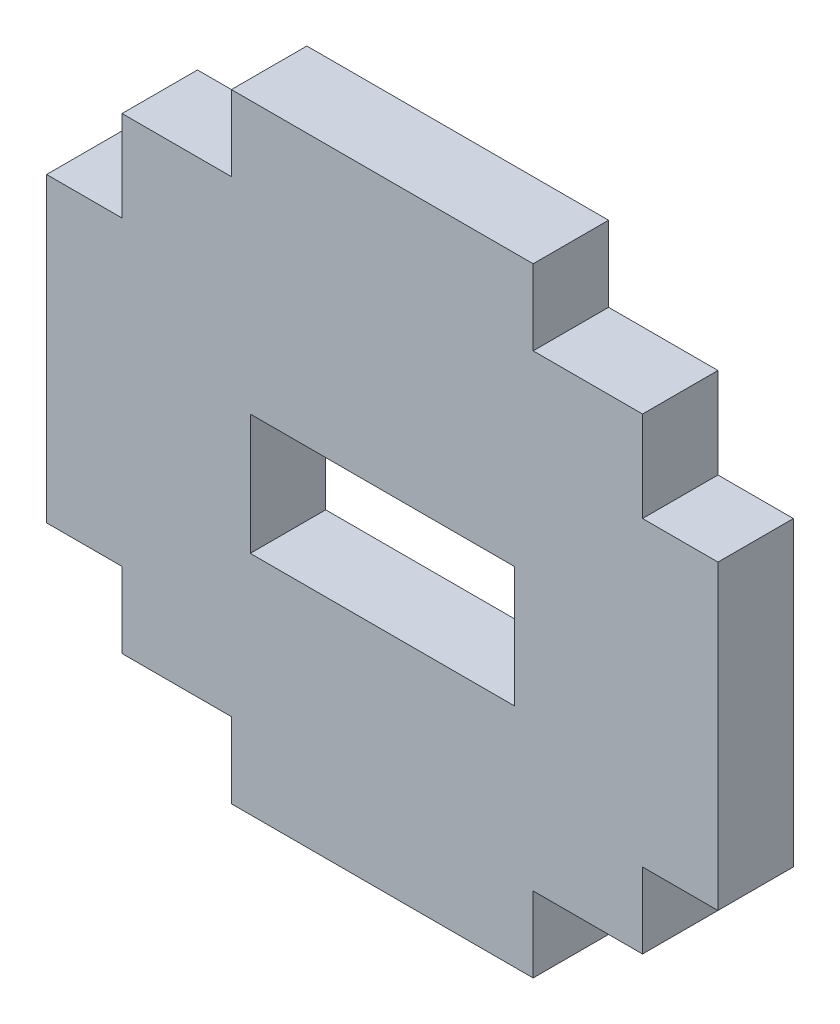
ISO-10303-21;
HEADER;
FILE_DESCRIPTION(('STEP AP214'),'2;1');
FILE_NAME('part.step','',(''),(''),'','','');
FILE_SCHEMA(('AUTOMOTIVE_DESIGN { 1 0 10303 214 1 1 1 1 }'));
ENDSEC;
DATA;
#1=APPLICATION_CONTEXT('core data for automotive mechanical design processes');
#2=APPLICATION_PROTOCOL_DEFINITION('international standard','automotive_design',2000,#1);
#3=PRODUCT_CONTEXT('',#1,'mechanical');
#4=PRODUCT('Part','Part','',(#3));
#5=PRODUCT_RELATED_PRODUCT_CATEGORY('part','',(#4));
#6=PRODUCT_DEFINITION_FORMATION('','',#4);
#7=PRODUCT_DEFINITION_CONTEXT('part definition',#1,'design');
#8=PRODUCT_DEFINITION('design','',#6,#7);
#9=PRODUCT_DEFINITION_SHAPE('','',#8);
#10=(LENGTH_UNIT() NAMED_UNIT(*) SI_UNIT(.MILLI.,.METRE.));
#11=(NAMED_UNIT(*) PLANE_ANGLE_UNIT() SI_UNIT($,.RADIAN.));
#12=(NAMED_UNIT(*) SI_UNIT($,.STERADIAN.) SOLID_ANGLE_UNIT());
#13=UNCERTAINTY_MEASURE_WITH_UNIT(LENGTH_MEASURE(1.E-05),#10,'distance_accuracy_value','');
#14=(GEOMETRIC_REPRESENTATION_CONTEXT(3) GLOBAL_UNCERTAINTY_ASSIGNED_CONTEXT((#13)) GLOBAL_UNIT_ASSIGNED_CONTEXT((#10,
#11,#12)) REPRESENTATION_CONTEXT('',''));
#15=CARTESIAN_POINT('',(0.,0.,0.));
#16=DIRECTION('',(0.,0.,1.));
#17=DIRECTION('',(1.,0.,0.));
#18=AXIS2_PLACEMENT_3D('',#15,#16,#17);
#19=CARTESIAN_POINT('',(0.,18.,5.));
#20=DIRECTION('',(0.,1.,0.));
#21=DIRECTION('',(0.,0.,1.));
#22=AXIS2_PLACEMENT_3D('',#19,#20,#21);
#23=PLANE('',#22);
#24=DIRECTION('',(1.,0.,0.));
#25=VECTOR('',#24,1.);
#26=CARTESIAN_POINT('',(0.,18.,0.));
#27=LINE('',#26,#25);
#28=CARTESIAN_POINT('',(8.5,18.,0.));
#29=VERTEX_POINT('',#28);
#30=CARTESIAN_POINT('',(26.,18.,0.));
#31=VERTEX_POINT('',#30);
#32=EDGE_CURVE('E274',#29,#31,#27,.T.);
#33=ORIENTED_EDGE('',*,*,#32,.T.);
#34=DIRECTION('',(0.,0.,-1.));
#35=VECTOR('',#34,1.);
#36=CARTESIAN_POINT('',(26.,18.,5.));
#37=LINE('',#36,#35);
#38=CARTESIAN_POINT('',(26.,18.,5.));
#39=VERTEX_POINT('',#38);
#40=EDGE_CURVE('E11',#39,#31,#37,.T.);
#41=ORIENTED_EDGE('',*,*,#40,.F.);
#42=DIRECTION('',(1.,0.,0.));
#43=VECTOR('',#42,1.);
#44=CARTESIAN_POINT('',(0.,18.,5.));
#45=LINE('',#44,#43);
#46=CARTESIAN_POINT('',(8.5,18.,5.));
#47=VERTEX_POINT('',#46);
#48=EDGE_CURVE('E209',#47,#39,#45,.T.);
#49=ORIENTED_EDGE('',*,*,#48,.F.);
#50=DIRECTION('',(0.,0.,-1.));
#51=VECTOR('',#50,1.);
#52=CARTESIAN_POINT('',(8.5,18.,5.));
#53=LINE('',#52,#51);
#54=EDGE_CURVE('E53',#47,#29,#53,.T.);
#55=ORIENTED_EDGE('',*,*,#54,.T.);
#56=EDGE_LOOP('',(#33,#41,#49,#55));
#57=FACE_BOUND('',#56,.T.);
#58=ADVANCED_FACE('F34',(#57),#23,.F.);
#59=CARTESIAN_POINT('',(26.,0.,5.));
#60=DIRECTION('',(1.,0.,0.));
#61=DIRECTION('',(0.,0.,-1.));
#62=AXIS2_PLACEMENT_3D('',#59,#60,#61);
#63=PLANE('',#62);
#64=DIRECTION('',(0.,-1.,0.));
#65=VECTOR('',#64,1.);
#66=CARTESIAN_POINT('',(26.,0.,0.));
#67=LINE('',#66,#65);
#68=CARTESIAN_POINT('',(26.,10.,0.));
#69=VERTEX_POINT('',#68);
#70=EDGE_CURVE('E215',#31,#69,#67,.T.);
#71=ORIENTED_EDGE('',*,*,#70,.T.);
#72=DIRECTION('',(0.,0.,-1.));
#73=VECTOR('',#72,1.);
#74=CARTESIAN_POINT('',(26.,10.,5.));
#75=LINE('',#74,#73);
#76=CARTESIAN_POINT('',(26.,10.,5.));
#77=VERTEX_POINT('',#76);
#78=EDGE_CURVE('E44',#77,#69,#75,.T.);
#79=ORIENTED_EDGE('',*,*,#78,.F.);
#80=DIRECTION('',(0.,-1.,0.));
#81=VECTOR('',#80,1.);
#82=CARTESIAN_POINT('',(26.,0.,5.));
#83=LINE('',#82,#81);
#84=EDGE_CURVE('E203',#39,#77,#83,.T.);
#85=ORIENTED_EDGE('',*,*,#84,.F.);
#86=ORIENTED_EDGE('',*,*,#40,.T.);
#87=EDGE_LOOP('',(#71,#79,#85,#86));
#88=FACE_BOUND('',#87,.T.);
#89=ADVANCED_FACE('F214',(#88),#63,.F.);
#90=CARTESIAN_POINT('',(0.,10.,5.));
#91=DIRECTION('',(0.,1.,0.));
#92=DIRECTION('',(0.,0.,1.));
#93=AXIS2_PLACEMENT_3D('',#90,#91,#92);
#94=PLANE('',#93);
#95=DIRECTION('',(1.,0.,0.));
#96=VECTOR('',#95,1.);
#97=CARTESIAN_POINT('',(0.,10.,0.));
#98=LINE('',#97,#96);
#99=CARTESIAN_POINT('',(8.5,10.,0.));
#100=VERTEX_POINT('',#99);
#101=EDGE_CURVE('E277',#100,#69,#98,.T.);
#102=ORIENTED_EDGE('',*,*,#101,.F.);
#103=DIRECTION('',(0.,0.,-1.));
#104=VECTOR('',#103,1.);
#105=CARTESIAN_POINT('',(8.5,10.,5.));
#106=LINE('',#105,#104);
#107=CARTESIAN_POINT('',(8.5,10.,5.));
#108=VERTEX_POINT('',#107);
#109=EDGE_CURVE('E127',#108,#100,#106,.T.);
#110=ORIENTED_EDGE('',*,*,#109,.F.);
#111=DIRECTION('',(1.,0.,0.));
#112=VECTOR('',#111,1.);
#113=CARTESIAN_POINT('',(0.,10.,5.));
#114=LINE('',#113,#112);
#115=EDGE_CURVE('E208',#108,#77,#114,.T.);
#116=ORIENTED_EDGE('',*,*,#115,.T.);
#117=ORIENTED_EDGE('',*,*,#78,.T.);
#118=EDGE_LOOP('',(#102,#110,#116,#117));
#119=FACE_BOUND('',#118,.T.);
#120=ADVANCED_FACE('F219',(#119),#94,.T.);
#121=CARTESIAN_POINT('',(7.25,0.,5.));
#122=DIRECTION('',(-1.,0.,0.));
#123=DIRECTION('',(0.,0.,1.));
#124=AXIS2_PLACEMENT_3D('',#121,#122,#123);
#125=PLANE('',#124);
#126=DIRECTION('',(0.,1.,0.));
#127=VECTOR('',#126,1.);
#128=CARTESIAN_POINT('',(7.25,0.,0.));
#129=LINE('',#128,#127);
#130=CARTESIAN_POINT('',(7.25,31.,0.));
#131=VERTEX_POINT('',#130);
#132=CARTESIAN_POINT('',(7.25,36.,0.));
#133=VERTEX_POINT('',#132);
#134=EDGE_CURVE('E226',#131,#133,#129,.T.);
#135=ORIENTED_EDGE('',*,*,#134,.F.);
#136=DIRECTION('',(0.,0.,-1.));
#137=VECTOR('',#136,1.);
#138=CARTESIAN_POINT('',(7.25,31.,5.));
#139=LINE('',#138,#137);
#140=CARTESIAN_POINT('',(7.25,31.,5.));
#141=VERTEX_POINT('',#140);
#142=EDGE_CURVE('E38',#141,#131,#139,.T.);
#143=ORIENTED_EDGE('',*,*,#142,.F.);
#144=DIRECTION('',(0.,1.,0.));
#145=VECTOR('',#144,1.);
#146=CARTESIAN_POINT('',(7.25,0.,5.));
#147=LINE('',#146,#145);
#148=CARTESIAN_POINT('',(7.25,36.,5.));
#149=VERTEX_POINT('',#148);
#150=EDGE_CURVE('E282',#141,#149,#147,.T.);
#151=ORIENTED_EDGE('',*,*,#150,.T.);
#152=DIRECTION('',(0.,0.,-1.));
#153=VECTOR('',#152,1.);
#154=CARTESIAN_POINT('',(7.25,36.,5.));
#155=LINE('',#154,#153);
#156=EDGE_CURVE('E222',#149,#133,#155,.T.);
#157=ORIENTED_EDGE('',*,*,#156,.T.);
#158=EDGE_LOOP('',(#135,#143,#151,#157));
#159=FACE_BOUND('',#158,.T.);
#160=ADVANCED_FACE('F36',(#159),#125,.T.);
#161=CARTESIAN_POINT('',(0.,31.,5.));
#162=DIRECTION('',(0.,1.,0.));
#163=DIRECTION('',(0.,0.,1.));
#164=AXIS2_PLACEMENT_3D('',#161,#162,#163);
#165=PLANE('',#164);
#166=DIRECTION('',(1.,0.,0.));
#167=VECTOR('',#166,1.);
#168=CARTESIAN_POINT('',(0.,31.,0.));
#169=LINE('',#168,#167);
#170=CARTESIAN_POINT('',(0.,31.,0.));
#171=VERTEX_POINT('',#170);
#172=EDGE_CURVE('E229',#171,#131,#169,.T.);
#173=ORIENTED_EDGE('',*,*,#172,.F.);
#174=DIRECTION('',(0.,0.,-1.));
#175=VECTOR('',#174,1.);
#176=CARTESIAN_POINT('',(0.,31.,5.));
#177=LINE('',#176,#175);
#178=CARTESIAN_POINT('',(0.,31.,5.));
#179=VERTEX_POINT('',#178);
#180=EDGE_CURVE('E324',#179,#171,#177,.T.);
#181=ORIENTED_EDGE('',*,*,#180,.F.);
#182=DIRECTION('',(1.,0.,0.));
#183=VECTOR('',#182,1.);
#184=CARTESIAN_POINT('',(0.,31.,5.));
#185=LINE('',#184,#183);
#186=EDGE_CURVE('E333',#179,#141,#185,.T.);
#187=ORIENTED_EDGE('',*,*,#186,.T.);
#188=ORIENTED_EDGE('',*,*,#142,.T.);
#189=EDGE_LOOP('',(#173,#181,#187,#188));
#190=FACE_BOUND('',#189,.T.);
#191=ADVANCED_FACE('F331',(#190),#165,.T.);
#192=CARTESIAN_POINT('',(0.,0.,5.));
#193=DIRECTION('',(-1.,0.,0.));
#194=DIRECTION('',(0.,0.,1.));
#195=AXIS2_PLACEMENT_3D('',#192,#193,#194);
#196=PLANE('',#195);
#197=DIRECTION('',(0.,1.,0.));
#198=VECTOR('',#197,1.);
#199=CARTESIAN_POINT('',(0.,0.,0.));
#200=LINE('',#199,#198);
#201=CARTESIAN_POINT('',(0.,25.,0.));
#202=VERTEX_POINT('',#201);
#203=EDGE_CURVE('E232',#202,#171,#200,.T.);
#204=ORIENTED_EDGE('',*,*,#203,.F.);
#205=DIRECTION('',(0.,0.,-1.));
#206=VECTOR('',#205,1.);
#207=CARTESIAN_POINT('',(0.,25.,5.));
#208=LINE('',#207,#206);
#209=CARTESIAN_POINT('',(0.,25.,5.));
#210=VERTEX_POINT('',#209);
#211=EDGE_CURVE('E323',#210,#202,#208,.T.);
#212=ORIENTED_EDGE('',*,*,#211,.F.);
#213=DIRECTION('',(0.,1.,0.));
#214=VECTOR('',#213,1.);
#215=CARTESIAN_POINT('',(0.,0.,5.));
#216=LINE('',#215,#214);
#217=EDGE_CURVE('E343',#210,#179,#216,.T.);
#218=ORIENTED_EDGE('',*,*,#217,.T.);
#219=ORIENTED_EDGE('',*,*,#180,.T.);
#220=EDGE_LOOP('',(#204,#212,#218,#219));
#221=FACE_BOUND('',#220,.T.);
#222=ADVANCED_FACE('F340',(#221),#196,.T.);
#223=CARTESIAN_POINT('',(0.,25.,5.));
#224=DIRECTION('',(0.,-1.,0.));
#225=DIRECTION('',(0.,0.,-1.));
#226=AXIS2_PLACEMENT_3D('',#223,#224,#225);
#227=PLANE('',#226);
#228=DIRECTION('',(-1.,0.,0.));
#229=VECTOR('',#228,1.);
#230=CARTESIAN_POINT('',(0.,25.,0.));
#231=LINE('',#230,#229);
#232=CARTESIAN_POINT('',(-5.,25.,0.));
#233=VERTEX_POINT('',#232);
#234=EDGE_CURVE('E236',#202,#233,#231,.T.);
#235=ORIENTED_EDGE('',*,*,#234,.T.);
#236=DIRECTION('',(0.,0.,-1.));
#237=VECTOR('',#236,1.);
#238=CARTESIAN_POINT('',(-5.,25.,5.));
#239=LINE('',#238,#237);
#240=CARTESIAN_POINT('',(-5.,25.,5.));
#241=VERTEX_POINT('',#240);
#242=EDGE_CURVE('E320',#241,#233,#239,.T.);
#243=ORIENTED_EDGE('',*,*,#242,.F.);
#244=DIRECTION('',(-1.,0.,0.));
#245=VECTOR('',#244,1.);
#246=CARTESIAN_POINT('',(0.,25.,5.));
#247=LINE('',#246,#245);
#248=EDGE_CURVE('E346',#210,#241,#247,.T.);
#249=ORIENTED_EDGE('',*,*,#248,.F.);
#250=ORIENTED_EDGE('',*,*,#211,.T.);
#251=EDGE_LOOP('',(#235,#243,#249,#250));
#252=FACE_BOUND('',#251,.T.);
#253=ADVANCED_FACE('F347',(#252),#227,.F.);
#254=CARTESIAN_POINT('',(-5.,0.,5.));
#255=DIRECTION('',(1.,0.,0.));
#256=DIRECTION('',(0.,1.,0.));
#257=AXIS2_PLACEMENT_3D('',#254,#255,#256);
#258=PLANE('',#257);
#259=DIRECTION('',(0.,-1.,0.));
#260=VECTOR('',#259,1.);
#261=CARTESIAN_POINT('',(-5.,0.,0.));
#262=LINE('',#261,#260);
#263=CARTESIAN_POINT('',(-5.,5.,0.));
#264=VERTEX_POINT('',#263);
#265=EDGE_CURVE('E239',#233,#264,#262,.T.);
#266=ORIENTED_EDGE('',*,*,#265,.T.);
#267=DIRECTION('',(0.,0.,-1.));
#268=VECTOR('',#267,1.);
#269=CARTESIAN_POINT('',(-5.,5.,5.));
#270=LINE('',#269,#268);
#271=CARTESIAN_POINT('',(-5.,5.,5.));
#272=VERTEX_POINT('',#271);
#273=EDGE_CURVE('E318',#272,#264,#270,.T.);
#274=ORIENTED_EDGE('',*,*,#273,.F.);
#275=DIRECTION('',(0.,-1.,0.));
#276=VECTOR('',#275,1.);
#277=CARTESIAN_POINT('',(-5.,0.,5.));
#278=LINE('',#277,#276);
#279=EDGE_CURVE('E350',#241,#272,#278,.T.);
#280=ORIENTED_EDGE('',*,*,#279,.F.);
#281=ORIENTED_EDGE('',*,*,#242,.T.);
#282=EDGE_LOOP('',(#266,#274,#280,#281));
#283=FACE_BOUND('',#282,.T.);
#284=ADVANCED_FACE('F460',(#283),#258,.F.);
#285=CARTESIAN_POINT('',(0.,5.,5.));
#286=DIRECTION('',(0.,-1.,0.));
#287=DIRECTION('',(1.,0.,0.));
#288=AXIS2_PLACEMENT_3D('',#285,#286,#287);
#289=PLANE('',#288);
#290=DIRECTION('',(-1.,0.,0.));
#291=VECTOR('',#290,1.);
#292=CARTESIAN_POINT('',(0.,5.,0.));
#293=LINE('',#292,#291);
#294=CARTESIAN_POINT('',(0.,5.,0.));
#295=VERTEX_POINT('',#294);
#296=EDGE_CURVE('E242',#295,#264,#293,.T.);
#297=ORIENTED_EDGE('',*,*,#296,.F.);
#298=DIRECTION('',(0.,0.,-1.));
#299=VECTOR('',#298,1.);
#300=CARTESIAN_POINT('',(0.,5.,5.));
#301=LINE('',#300,#299);
#302=CARTESIAN_POINT('',(0.,5.,5.));
#303=VERTEX_POINT('',#302);
#304=EDGE_CURVE('E316',#303,#295,#301,.T.);
#305=ORIENTED_EDGE('',*,*,#304,.F.);
#306=DIRECTION('',(-1.,0.,0.));
#307=VECTOR('',#306,1.);
#308=CARTESIAN_POINT('',(0.,5.,5.));
#309=LINE('',#308,#307);
#310=EDGE_CURVE('E358',#303,#272,#309,.T.);
#311=ORIENTED_EDGE('',*,*,#310,.T.);
#312=ORIENTED_EDGE('',*,*,#273,.T.);
#313=EDGE_LOOP('',(#297,#305,#311,#312));
#314=FACE_BOUND('',#313,.T.);
#315=ADVANCED_FACE('F457',(#314),#289,.T.);
#316=CARTESIAN_POINT('',(0.,0.,0.));
#317=VERTEX_POINT('',#316);
#318=EDGE_CURVE('E237',#317,#295,#200,.T.);
#319=ORIENTED_EDGE('',*,*,#318,.F.);
#320=DIRECTION('',(0.,0.,-1.));
#321=VECTOR('',#320,1.);
#322=CARTESIAN_POINT('',(0.,0.,5.));
#323=LINE('',#322,#321);
#324=CARTESIAN_POINT('',(0.,0.,5.));
#325=VERTEX_POINT('',#324);
#326=EDGE_CURVE('E314',#325,#317,#323,.T.);
#327=ORIENTED_EDGE('',*,*,#326,.F.);
#328=EDGE_CURVE('E353',#325,#303,#216,.T.);
#329=ORIENTED_EDGE('',*,*,#328,.T.);
#330=ORIENTED_EDGE('',*,*,#304,.T.);
#331=EDGE_LOOP('',(#319,#327,#329,#330));
#332=FACE_BOUND('',#331,.T.);
#333=ADVANCED_FACE('F455',(#332),#196,.T.);
#334=CARTESIAN_POINT('',(0.,0.,5.));
#335=DIRECTION('',(0.,1.,0.));
#336=DIRECTION('',(0.,0.,1.));
#337=AXIS2_PLACEMENT_3D('',#334,#335,#336);
#338=PLANE('',#337);
#339=DIRECTION('',(1.,0.,0.));
#340=VECTOR('',#339,1.);
#341=CARTESIAN_POINT('',(0.,0.,0.));
#342=LINE('',#341,#340);
#343=CARTESIAN_POINT('',(7.25,0.,0.));
#344=VERTEX_POINT('',#343);
#345=EDGE_CURVE('E245',#317,#344,#342,.T.);
#346=ORIENTED_EDGE('',*,*,#345,.T.);
#347=DIRECTION('',(0.,0.,-1.));
#348=VECTOR('',#347,1.);
#349=CARTESIAN_POINT('',(7.25,0.,5.));
#350=LINE('',#349,#348);
#351=CARTESIAN_POINT('',(7.25,0.,5.));
#352=VERTEX_POINT('',#351);
#353=EDGE_CURVE('E311',#352,#344,#350,.T.);
#354=ORIENTED_EDGE('',*,*,#353,.F.);
#355=DIRECTION('',(1.,0.,0.));
#356=VECTOR('',#355,1.);
#357=CARTESIAN_POINT('',(0.,0.,5.));
#358=LINE('',#357,#356);
#359=EDGE_CURVE('E357',#325,#352,#358,.T.);
#360=ORIENTED_EDGE('',*,*,#359,.F.);
#361=ORIENTED_EDGE('',*,*,#326,.T.);
#362=EDGE_LOOP('',(#346,#354,#360,#361));
#363=FACE_BOUND('',#362,.T.);
#364=ADVANCED_FACE('F454',(#363),#338,.F.);
#365=CARTESIAN_POINT('',(7.25,0.,5.));
#366=DIRECTION('',(1.,0.,0.));
#367=DIRECTION('',(0.,0.,-1.));
#368=AXIS2_PLACEMENT_3D('',#365,#366,#367);
#369=PLANE('',#368);
#370=DIRECTION('',(0.,-1.,0.));
#371=VECTOR('',#370,1.);
#372=CARTESIAN_POINT('',(7.25,0.,0.));
#373=LINE('',#372,#371);
#374=CARTESIAN_POINT('',(7.25,-5.,0.));
#375=VERTEX_POINT('',#374);
#376=EDGE_CURVE('E247',#344,#375,#373,.T.);
#377=ORIENTED_EDGE('',*,*,#376,.T.);
#378=DIRECTION('',(0.,0.,-1.));
#379=VECTOR('',#378,1.);
#380=CARTESIAN_POINT('',(7.25,-5.,5.));
#381=LINE('',#380,#379);
#382=CARTESIAN_POINT('',(7.25,-5.,5.));
#383=VERTEX_POINT('',#382);
#384=EDGE_CURVE('E308',#383,#375,#381,.T.);
#385=ORIENTED_EDGE('',*,*,#384,.F.);
#386=DIRECTION('',(0.,-1.,0.));
#387=VECTOR('',#386,1.);
#388=CARTESIAN_POINT('',(7.25,0.,5.));
#389=LINE('',#388,#387);
#390=EDGE_CURVE('E361',#352,#383,#389,.T.);
#391=ORIENTED_EDGE('',*,*,#390,.F.);
#392=ORIENTED_EDGE('',*,*,#353,.T.);
#393=EDGE_LOOP('',(#377,#385,#391,#392));
#394=FACE_BOUND('',#393,.T.);
#395=ADVANCED_FACE('F449',(#394),#369,.F.);
#396=CARTESIAN_POINT('',(0.,-5.,5.));
#397=DIRECTION('',(0.,1.,0.));
#398=DIRECTION('',(-1.,0.,0.));
#399=AXIS2_PLACEMENT_3D('',#396,#397,#398);
#400=PLANE('',#399);
#401=DIRECTION('',(1.,0.,0.));
#402=VECTOR('',#401,1.);
#403=CARTESIAN_POINT('',(0.,-5.,0.));
#404=LINE('',#403,#402);
#405=CARTESIAN_POINT('',(27.25,-5.,0.));
#406=VERTEX_POINT('',#405);
#407=EDGE_CURVE('E250',#375,#406,#404,.T.);
#408=ORIENTED_EDGE('',*,*,#407,.T.);
#409=DIRECTION('',(0.,0.,-1.));
#410=VECTOR('',#409,1.);
#411=CARTESIAN_POINT('',(27.25,-5.,5.));
#412=LINE('',#411,#410);
#413=CARTESIAN_POINT('',(27.25,-5.,5.));
#414=VERTEX_POINT('',#413);
#415=EDGE_CURVE('E306',#414,#406,#412,.T.);
#416=ORIENTED_EDGE('',*,*,#415,.F.);
#417=DIRECTION('',(1.,0.,0.));
#418=VECTOR('',#417,1.);
#419=CARTESIAN_POINT('',(0.,-5.,5.));
#420=LINE('',#419,#418);
#421=EDGE_CURVE('E371',#383,#414,#420,.T.);
#422=ORIENTED_EDGE('',*,*,#421,.F.);
#423=ORIENTED_EDGE('',*,*,#384,.T.);
#424=EDGE_LOOP('',(#408,#416,#422,#423));
#425=FACE_BOUND('',#424,.T.);
#426=ADVANCED_FACE('F442',(#425),#400,.F.);
#427=CARTESIAN_POINT('',(27.25,0.,5.));
#428=DIRECTION('',(1.,0.,0.));
#429=DIRECTION('',(0.,1.,0.));
#430=AXIS2_PLACEMENT_3D('',#427,#428,#429);
#431=PLANE('',#430);
#432=DIRECTION('',(0.,-1.,0.));
#433=VECTOR('',#432,1.);
#434=CARTESIAN_POINT('',(27.25,0.,0.));
#435=LINE('',#434,#433);
#436=CARTESIAN_POINT('',(27.25,0.,0.));
#437=VERTEX_POINT('',#436);
#438=EDGE_CURVE('E253',#437,#406,#435,.T.);
#439=ORIENTED_EDGE('',*,*,#438,.F.);
#440=DIRECTION('',(0.,0.,-1.));
#441=VECTOR('',#440,1.);
#442=CARTESIAN_POINT('',(27.25,0.,5.));
#443=LINE('',#442,#441);
#444=CARTESIAN_POINT('',(27.25,0.,5.));
#445=VERTEX_POINT('',#444);
#446=EDGE_CURVE('E304',#445,#437,#443,.T.);
#447=ORIENTED_EDGE('',*,*,#446,.F.);
#448=DIRECTION('',(0.,-1.,0.));
#449=VECTOR('',#448,1.);
#450=CARTESIAN_POINT('',(27.25,0.,5.));
#451=LINE('',#450,#449);
#452=EDGE_CURVE('E373',#445,#414,#451,.T.);
#453=ORIENTED_EDGE('',*,*,#452,.T.);
#454=ORIENTED_EDGE('',*,*,#415,.T.);
#455=EDGE_LOOP('',(#439,#447,#453,#454));
#456=FACE_BOUND('',#455,.T.);
#457=ADVANCED_FACE('F438',(#456),#431,.T.);
#458=CARTESIAN_POINT('',(34.5,0.,0.));
#459=VERTEX_POINT('',#458);
#460=EDGE_CURVE('E248',#437,#459,#342,.T.);
#461=ORIENTED_EDGE('',*,*,#460,.T.);
#462=DIRECTION('',(0.,0.,-1.));
#463=VECTOR('',#462,1.);
#464=CARTESIAN_POINT('',(34.5,0.,5.));
#465=LINE('',#464,#463);
#466=CARTESIAN_POINT('',(34.5,0.,5.));
#467=VERTEX_POINT('',#466);
#468=EDGE_CURVE('E301',#467,#459,#465,.T.);
#469=ORIENTED_EDGE('',*,*,#468,.F.);
#470=EDGE_CURVE('E363',#445,#467,#358,.T.);
#471=ORIENTED_EDGE('',*,*,#470,.F.);
#472=ORIENTED_EDGE('',*,*,#446,.T.);
#473=EDGE_LOOP('',(#461,#469,#471,#472));
#474=FACE_BOUND('',#473,.T.);
#475=ADVANCED_FACE('F433',(#474),#338,.F.);
#476=CARTESIAN_POINT('',(34.5,0.,5.));
#477=DIRECTION('',(-1.,0.,0.));
#478=DIRECTION('',(0.,0.,1.));
#479=AXIS2_PLACEMENT_3D('',#476,#477,#478);
#480=PLANE('',#479);
#481=DIRECTION('',(0.,1.,0.));
#482=VECTOR('',#481,1.);
#483=CARTESIAN_POINT('',(34.5,0.,0.));
#484=LINE('',#483,#482);
#485=CARTESIAN_POINT('',(34.5,5.,0.));
#486=VERTEX_POINT('',#485);
#487=EDGE_CURVE('E256',#459,#486,#484,.T.);
#488=ORIENTED_EDGE('',*,*,#487,.T.);
#489=DIRECTION('',(0.,0.,-1.));
#490=VECTOR('',#489,1.);
#491=CARTESIAN_POINT('',(34.5,5.,5.));
#492=LINE('',#491,#490);
#493=CARTESIAN_POINT('',(34.5,5.,5.));
#494=VERTEX_POINT('',#493);
#495=EDGE_CURVE('E298',#494,#486,#492,.T.);
#496=ORIENTED_EDGE('',*,*,#495,.F.);
#497=DIRECTION('',(0.,1.,0.));
#498=VECTOR('',#497,1.);
#499=CARTESIAN_POINT('',(34.5,0.,5.));
#500=LINE('',#499,#498);
#501=EDGE_CURVE('E376',#467,#494,#500,.T.);
#502=ORIENTED_EDGE('',*,*,#501,.F.);
#503=ORIENTED_EDGE('',*,*,#468,.T.);
#504=EDGE_LOOP('',(#488,#496,#502,#503));
#505=FACE_BOUND('',#504,.T.);
#506=ADVANCED_FACE('F429',(#505),#480,.F.);
#507=CARTESIAN_POINT('',(0.,5.,5.));
#508=DIRECTION('',(0.,1.,0.));
#509=DIRECTION('',(0.,0.,1.));
#510=AXIS2_PLACEMENT_3D('',#507,#508,#509);
#511=PLANE('',#510);
#512=DIRECTION('',(1.,0.,0.));
#513=VECTOR('',#512,1.);
#514=CARTESIAN_POINT('',(0.,5.,0.));
#515=LINE('',#514,#513);
#516=CARTESIAN_POINT('',(39.5,5.,0.));
#517=VERTEX_POINT('',#516);
#518=EDGE_CURVE('E258',#486,#517,#515,.T.);
#519=ORIENTED_EDGE('',*,*,#518,.T.);
#520=DIRECTION('',(0.,0.,-1.));
#521=VECTOR('',#520,1.);
#522=CARTESIAN_POINT('',(39.5,5.,5.));
#523=LINE('',#522,#521);
#524=CARTESIAN_POINT('',(39.5,5.,5.));
#525=VERTEX_POINT('',#524);
#526=EDGE_CURVE('E296',#525,#517,#523,.T.);
#527=ORIENTED_EDGE('',*,*,#526,.F.);
#528=DIRECTION('',(1.,0.,0.));
#529=VECTOR('',#528,1.);
#530=CARTESIAN_POINT('',(0.,5.,5.));
#531=LINE('',#530,#529);
#532=EDGE_CURVE('E378',#494,#525,#531,.T.);
#533=ORIENTED_EDGE('',*,*,#532,.F.);
#534=ORIENTED_EDGE('',*,*,#495,.T.);
#535=EDGE_LOOP('',(#519,#527,#533,#534));
#536=FACE_BOUND('',#535,.T.);
#537=ADVANCED_FACE('F424',(#536),#511,.F.);
#538=CARTESIAN_POINT('',(39.5,0.,5.));
#539=DIRECTION('',(1.,0.,0.));
#540=DIRECTION('',(0.,1.,0.));
#541=AXIS2_PLACEMENT_3D('',#538,#539,#540);
#542=PLANE('',#541);
#543=DIRECTION('',(0.,-1.,0.));
#544=VECTOR('',#543,1.);
#545=CARTESIAN_POINT('',(39.5,0.,0.));
#546=LINE('',#545,#544);
#547=CARTESIAN_POINT('',(39.5,25.,0.));
#548=VERTEX_POINT('',#547);
#549=EDGE_CURVE('E262',#548,#517,#546,.T.);
#550=ORIENTED_EDGE('',*,*,#549,.F.);
#551=DIRECTION('',(0.,0.,-1.));
#552=VECTOR('',#551,1.);
#553=CARTESIAN_POINT('',(39.5,25.,5.));
#554=LINE('',#553,#552);
#555=CARTESIAN_POINT('',(39.5,25.,5.));
#556=VERTEX_POINT('',#555);
#557=EDGE_CURVE('E294',#556,#548,#554,.T.);
#558=ORIENTED_EDGE('',*,*,#557,.F.);
#559=DIRECTION('',(0.,-1.,0.));
#560=VECTOR('',#559,1.);
#561=CARTESIAN_POINT('',(39.5,0.,5.));
#562=LINE('',#561,#560);
#563=EDGE_CURVE('E381',#556,#525,#562,.T.);
#564=ORIENTED_EDGE('',*,*,#563,.T.);
#565=ORIENTED_EDGE('',*,*,#526,.T.);
#566=EDGE_LOOP('',(#550,#558,#564,#565));
#567=FACE_BOUND('',#566,.T.);
#568=ADVANCED_FACE('F418',(#567),#542,.T.);
#569=CARTESIAN_POINT('',(0.,25.,5.));
#570=DIRECTION('',(0.,1.,0.));
#571=DIRECTION('',(0.,0.,1.));
#572=AXIS2_PLACEMENT_3D('',#569,#570,#571);
#573=PLANE('',#572);
#574=DIRECTION('',(1.,0.,0.));
#575=VECTOR('',#574,1.);
#576=CARTESIAN_POINT('',(0.,25.,0.));
#577=LINE('',#576,#575);
#578=CARTESIAN_POINT('',(34.5,25.,0.));
#579=VERTEX_POINT('',#578);
#580=EDGE_CURVE('E265',#579,#548,#577,.T.);
#581=ORIENTED_EDGE('',*,*,#580,.F.);
#582=DIRECTION('',(0.,0.,-1.));
#583=VECTOR('',#582,1.);
#584=CARTESIAN_POINT('',(34.5,25.,5.));
#585=LINE('',#584,#583);
#586=CARTESIAN_POINT('',(34.5,25.,5.));
#587=VERTEX_POINT('',#586);
#588=EDGE_CURVE('E292',#587,#579,#585,.T.);
#589=ORIENTED_EDGE('',*,*,#588,.F.);
#590=DIRECTION('',(1.,0.,0.));
#591=VECTOR('',#590,1.);
#592=CARTESIAN_POINT('',(0.,25.,5.));
#593=LINE('',#592,#591);
#594=EDGE_CURVE('E384',#587,#556,#593,.T.);
#595=ORIENTED_EDGE('',*,*,#594,.T.);
#596=ORIENTED_EDGE('',*,*,#557,.T.);
#597=EDGE_LOOP('',(#581,#589,#595,#596));
#598=FACE_BOUND('',#597,.T.);
#599=ADVANCED_FACE('F413',(#598),#573,.T.);
#600=CARTESIAN_POINT('',(34.5,31.,0.));
#601=VERTEX_POINT('',#600);
#602=EDGE_CURVE('E259',#579,#601,#484,.T.);
#603=ORIENTED_EDGE('',*,*,#602,.T.);
#604=DIRECTION('',(0.,0.,-1.));
#605=VECTOR('',#604,1.);
#606=CARTESIAN_POINT('',(34.5,31.,5.));
#607=LINE('',#606,#605);
#608=CARTESIAN_POINT('',(34.5,31.,5.));
#609=VERTEX_POINT('',#608);
#610=EDGE_CURVE('E290',#609,#601,#607,.T.);
#611=ORIENTED_EDGE('',*,*,#610,.F.);
#612=EDGE_CURVE('E379',#587,#609,#500,.T.);
#613=ORIENTED_EDGE('',*,*,#612,.F.);
#614=ORIENTED_EDGE('',*,*,#588,.T.);
#615=EDGE_LOOP('',(#603,#611,#613,#614));
#616=FACE_BOUND('',#615,.T.);
#617=ADVANCED_FACE('F409',(#616),#480,.F.);
#618=CARTESIAN_POINT('',(27.25,31.,0.));
#619=VERTEX_POINT('',#618);
#620=EDGE_CURVE('E233',#619,#601,#169,.T.);
#621=ORIENTED_EDGE('',*,*,#620,.F.);
#622=DIRECTION('',(0.,0.,-1.));
#623=VECTOR('',#622,1.);
#624=CARTESIAN_POINT('',(27.25,31.,5.));
#625=LINE('',#624,#623);
#626=CARTESIAN_POINT('',(27.25,31.,5.));
#627=VERTEX_POINT('',#626);
#628=EDGE_CURVE('E288',#627,#619,#625,.T.);
#629=ORIENTED_EDGE('',*,*,#628,.F.);
#630=EDGE_CURVE('E355',#627,#609,#185,.T.);
#631=ORIENTED_EDGE('',*,*,#630,.T.);
#632=ORIENTED_EDGE('',*,*,#610,.T.);
#633=EDGE_LOOP('',(#621,#629,#631,#632));
#634=FACE_BOUND('',#633,.T.);
#635=ADVANCED_FACE('F405',(#634),#165,.T.);
#636=CARTESIAN_POINT('',(27.25,0.,5.));
#637=DIRECTION('',(-1.,0.,0.));
#638=DIRECTION('',(0.,-1.,0.));
#639=AXIS2_PLACEMENT_3D('',#636,#637,#638);
#640=PLANE('',#639);
#641=DIRECTION('',(0.,1.,0.));
#642=VECTOR('',#641,1.);
#643=CARTESIAN_POINT('',(27.25,0.,0.));
#644=LINE('',#643,#642);
#645=CARTESIAN_POINT('',(27.25,36.,0.));
#646=VERTEX_POINT('',#645);
#647=EDGE_CURVE('E268',#619,#646,#644,.T.);
#648=ORIENTED_EDGE('',*,*,#647,.T.);
#649=DIRECTION('',(0.,0.,-1.));
#650=VECTOR('',#649,1.);
#651=CARTESIAN_POINT('',(27.25,36.,5.));
#652=LINE('',#651,#650);
#653=CARTESIAN_POINT('',(27.25,36.,5.));
#654=VERTEX_POINT('',#653);
#655=EDGE_CURVE('E286',#654,#646,#652,.T.);
#656=ORIENTED_EDGE('',*,*,#655,.F.);
#657=DIRECTION('',(0.,1.,0.));
#658=VECTOR('',#657,1.);
#659=CARTESIAN_POINT('',(27.25,0.,5.));
#660=LINE('',#659,#658);
#661=EDGE_CURVE('E387',#627,#654,#660,.T.);
#662=ORIENTED_EDGE('',*,*,#661,.F.);
#663=ORIENTED_EDGE('',*,*,#628,.T.);
#664=EDGE_LOOP('',(#648,#656,#662,#663));
#665=FACE_BOUND('',#664,.T.);
#666=ADVANCED_FACE('F399',(#665),#640,.F.);
#667=CARTESIAN_POINT('',(0.,36.,5.));
#668=DIRECTION('',(0.,1.,0.));
#669=DIRECTION('',(0.,0.,1.));
#670=AXIS2_PLACEMENT_3D('',#667,#668,#669);
#671=PLANE('',#670);
#672=DIRECTION('',(1.,0.,0.));
#673=VECTOR('',#672,1.);
#674=CARTESIAN_POINT('',(0.,36.,0.));
#675=LINE('',#674,#673);
#676=EDGE_CURVE('E271',#133,#646,#675,.T.);
#677=ORIENTED_EDGE('',*,*,#676,.F.);
#678=ORIENTED_EDGE('',*,*,#156,.F.);
#679=DIRECTION('',(1.,0.,0.));
#680=VECTOR('',#679,1.);
#681=CARTESIAN_POINT('',(0.,36.,5.));
#682=LINE('',#681,#680);
#683=EDGE_CURVE('E389',#149,#654,#682,.T.);
#684=ORIENTED_EDGE('',*,*,#683,.T.);
#685=ORIENTED_EDGE('',*,*,#655,.T.);
#686=EDGE_LOOP('',(#677,#678,#684,#685));
#687=FACE_BOUND('',#686,.T.);
#688=ADVANCED_FACE('F393',(#687),#671,.T.);
#689=CARTESIAN_POINT('',(8.5,0.,5.));
#690=DIRECTION('',(1.,0.,0.));
#691=DIRECTION('',(0.,1.,0.));
#692=AXIS2_PLACEMENT_3D('',#689,#690,#691);
#693=PLANE('',#692);
#694=DIRECTION('',(0.,-1.,0.));
#695=VECTOR('',#694,1.);
#696=CARTESIAN_POINT('',(8.5,0.,0.));
#697=LINE('',#696,#695);
#698=EDGE_CURVE('E279',#29,#100,#697,.T.);
#699=ORIENTED_EDGE('',*,*,#698,.F.);
#700=ORIENTED_EDGE('',*,*,#54,.F.);
#701=DIRECTION('',(0.,-1.,0.));
#702=VECTOR('',#701,1.);
#703=CARTESIAN_POINT('',(8.5,0.,5.));
#704=LINE('',#703,#702);
#705=EDGE_CURVE('E220',#47,#108,#704,.T.);
#706=ORIENTED_EDGE('',*,*,#705,.T.);
#707=ORIENTED_EDGE('',*,*,#109,.T.);
#708=EDGE_LOOP('',(#699,#700,#706,#707));
#709=FACE_BOUND('',#708,.T.);
#710=ADVANCED_FACE('F479',(#709),#693,.T.);
#711=CARTESIAN_POINT('',(0.,0.,5.));
#712=DIRECTION('',(0.,0.,1.));
#713=DIRECTION('',(1.,0.,0.));
#714=AXIS2_PLACEMENT_3D('',#711,#712,#713);
#715=PLANE('',#714);
#716=ORIENTED_EDGE('',*,*,#150,.F.);
#717=ORIENTED_EDGE('',*,*,#186,.F.);
#718=ORIENTED_EDGE('',*,*,#217,.F.);
#719=ORIENTED_EDGE('',*,*,#248,.T.);
#720=ORIENTED_EDGE('',*,*,#279,.T.);
#721=ORIENTED_EDGE('',*,*,#310,.F.);
#722=ORIENTED_EDGE('',*,*,#328,.F.);
#723=ORIENTED_EDGE('',*,*,#359,.T.);
#724=ORIENTED_EDGE('',*,*,#390,.T.);
#725=ORIENTED_EDGE('',*,*,#421,.T.);
#726=ORIENTED_EDGE('',*,*,#452,.F.);
#727=ORIENTED_EDGE('',*,*,#470,.T.);
#728=ORIENTED_EDGE('',*,*,#501,.T.);
#729=ORIENTED_EDGE('',*,*,#532,.T.);
#730=ORIENTED_EDGE('',*,*,#563,.F.);
#731=ORIENTED_EDGE('',*,*,#594,.F.);
#732=ORIENTED_EDGE('',*,*,#612,.T.);
#733=ORIENTED_EDGE('',*,*,#630,.F.);
#734=ORIENTED_EDGE('',*,*,#661,.T.);
#735=ORIENTED_EDGE('',*,*,#683,.F.);
#736=EDGE_LOOP('',(#716,#717,#718,#719,#720,#721,#722,#723,#724,#725,#726,#727,#728,#729,#730,
#731,#732,#733,#734,#735));
#737=FACE_BOUND('',#736,.T.);
#738=ORIENTED_EDGE('',*,*,#48,.T.);
#739=ORIENTED_EDGE('',*,*,#84,.T.);
#740=ORIENTED_EDGE('',*,*,#115,.F.);
#741=ORIENTED_EDGE('',*,*,#705,.F.);
#742=EDGE_LOOP('',(#738,#739,#740,#741));
#743=FACE_BOUND('',#742,.T.);
#744=ADVANCED_FACE('F205',(#737,#743),#715,.T.);
#745=CARTESIAN_POINT('',(0.,0.,0.));
#746=DIRECTION('',(0.,0.,1.));
#747=DIRECTION('',(1.,0.,0.));
#748=AXIS2_PLACEMENT_3D('',#745,#746,#747);
#749=PLANE('',#748);
#750=ORIENTED_EDGE('',*,*,#134,.T.);
#751=ORIENTED_EDGE('',*,*,#676,.T.);
#752=ORIENTED_EDGE('',*,*,#647,.F.);
#753=ORIENTED_EDGE('',*,*,#620,.T.);
#754=ORIENTED_EDGE('',*,*,#602,.F.);
#755=ORIENTED_EDGE('',*,*,#580,.T.);
#756=ORIENTED_EDGE('',*,*,#549,.T.);
#757=ORIENTED_EDGE('',*,*,#518,.F.);
#758=ORIENTED_EDGE('',*,*,#487,.F.);
#759=ORIENTED_EDGE('',*,*,#460,.F.);
#760=ORIENTED_EDGE('',*,*,#438,.T.);
#761=ORIENTED_EDGE('',*,*,#407,.F.);
#762=ORIENTED_EDGE('',*,*,#376,.F.);
#763=ORIENTED_EDGE('',*,*,#345,.F.);
#764=ORIENTED_EDGE('',*,*,#318,.T.);
#765=ORIENTED_EDGE('',*,*,#296,.T.);
#766=ORIENTED_EDGE('',*,*,#265,.F.);
#767=ORIENTED_EDGE('',*,*,#234,.F.);
#768=ORIENTED_EDGE('',*,*,#203,.T.);
#769=ORIENTED_EDGE('',*,*,#172,.T.);
#770=EDGE_LOOP('',(#750,#751,#752,#753,#754,#755,#756,#757,#758,#759,#760,#761,#762,#763,#764,
#765,#766,#767,#768,#769));
#771=FACE_BOUND('',#770,.T.);
#772=ORIENTED_EDGE('',*,*,#32,.F.);
#773=ORIENTED_EDGE('',*,*,#698,.T.);
#774=ORIENTED_EDGE('',*,*,#101,.T.);
#775=ORIENTED_EDGE('',*,*,#70,.F.);
#776=EDGE_LOOP('',(#772,#773,#774,#775));
#777=FACE_BOUND('',#776,.T.);
#778=ADVANCED_FACE('F336',(#771,#777),#749,.F.);
#779=CLOSED_SHELL('',(#58,#89,#120,#160,#191,#222,#253,#284,#315,#333,#364,#395,#426,#457,#475,
#506,#537,#568,#599,#617,#635,#666,#688,#710,#744,#778));
#780=MANIFOLD_SOLID_BREP('B2',#779);
#781=ADVANCED_BREP_SHAPE_REPRESENTATION('',(#18,#780),#14);
#782=SHAPE_DEFINITION_REPRESENTATION(#9,#781);
ENDSEC;
END-ISO-10303-21;
